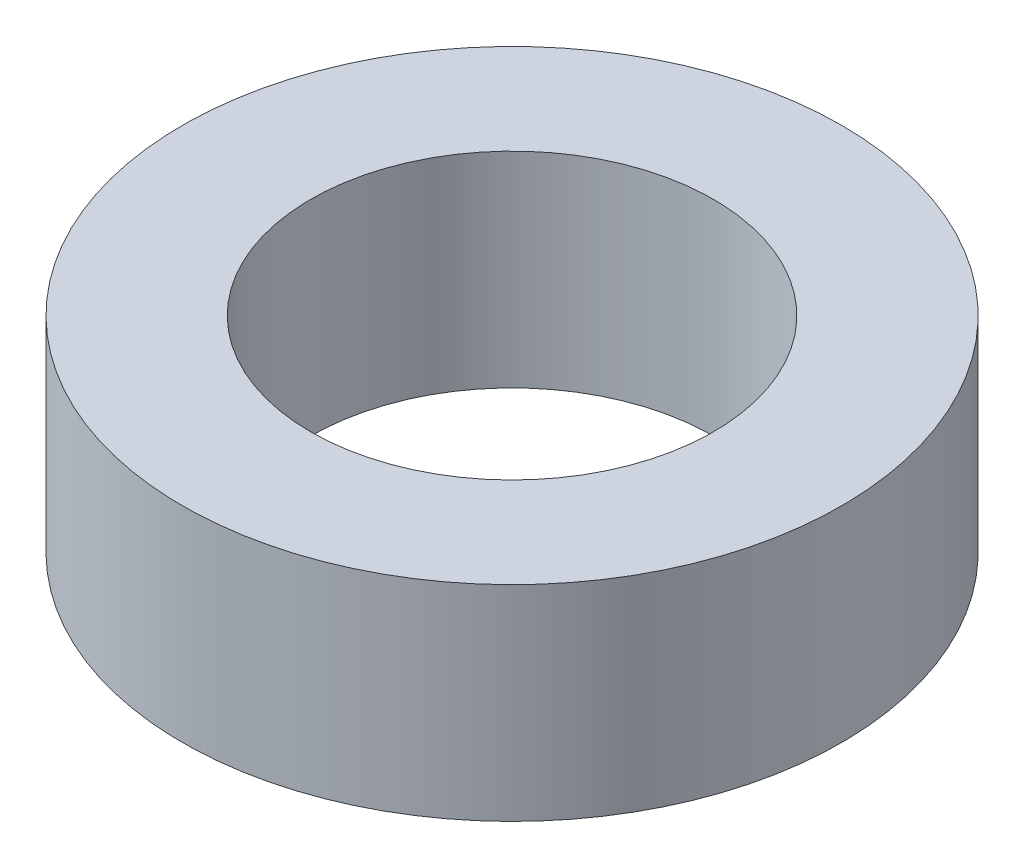
ISO-10303-21;
HEADER;
FILE_DESCRIPTION(('STEP AP214'),'2;1');
FILE_NAME('part.step','',(''),(''),'','','');
FILE_SCHEMA(('AUTOMOTIVE_DESIGN { 1 0 10303 214 1 1 1 1 }'));
ENDSEC;
DATA;
#1=APPLICATION_CONTEXT('core data for automotive mechanical design processes');
#2=APPLICATION_PROTOCOL_DEFINITION('international standard','automotive_design',2000,#1);
#3=PRODUCT_CONTEXT('',#1,'mechanical');
#4=PRODUCT('Part','Part','',(#3));
#5=PRODUCT_RELATED_PRODUCT_CATEGORY('part','',(#4));
#6=PRODUCT_DEFINITION_FORMATION('','',#4);
#7=PRODUCT_DEFINITION_CONTEXT('part definition',#1,'design');
#8=PRODUCT_DEFINITION('design','',#6,#7);
#9=PRODUCT_DEFINITION_SHAPE('','',#8);
#10=(LENGTH_UNIT() NAMED_UNIT(*) SI_UNIT(.MILLI.,.METRE.));
#11=(NAMED_UNIT(*) PLANE_ANGLE_UNIT() SI_UNIT($,.RADIAN.));
#12=(NAMED_UNIT(*) SI_UNIT($,.STERADIAN.) SOLID_ANGLE_UNIT());
#13=UNCERTAINTY_MEASURE_WITH_UNIT(LENGTH_MEASURE(1.E-05),#10,'distance_accuracy_value','');
#14=(GEOMETRIC_REPRESENTATION_CONTEXT(3) GLOBAL_UNCERTAINTY_ASSIGNED_CONTEXT((#13)) GLOBAL_UNIT_ASSIGNED_CONTEXT((#10,
#11,#12)) REPRESENTATION_CONTEXT('',''));
#15=CARTESIAN_POINT('',(0.,0.,0.));
#16=DIRECTION('',(0.,0.,1.));
#17=DIRECTION('',(1.,0.,0.));
#18=AXIS2_PLACEMENT_3D('',#15,#16,#17);
#19=CARTESIAN_POINT('',(0.,0.,0.));
#20=DIRECTION('',(0.,1.,0.));
#21=DIRECTION('',(0.,0.,1.));
#22=AXIS2_PLACEMENT_3D('',#19,#20,#21);
#23=PLANE('',#22);
#24=CARTESIAN_POINT('',(0.,0.,0.));
#25=DIRECTION('',(0.,-1.,0.));
#26=DIRECTION('',(0.,0.,-1.));
#27=AXIS2_PLACEMENT_3D('',#24,#25,#26);
#28=CIRCLE('',#27,45.);
#29=CARTESIAN_POINT('',(0.,0.,-45.));
#30=VERTEX_POINT('',#29);
#31=EDGE_CURVE('E26',#30,#30,#28,.F.);
#32=ORIENTED_EDGE('',*,*,#31,.F.);
#33=EDGE_LOOP('',(#32));
#34=FACE_BOUND('',#33,.T.);
#35=CARTESIAN_POINT('',(0.,0.,0.));
#36=DIRECTION('',(0.,1.,0.));
#37=DIRECTION('',(0.,0.,1.));
#38=AXIS2_PLACEMENT_3D('',#35,#36,#37);
#39=CIRCLE('',#38,27.5);
#40=CARTESIAN_POINT('',(0.,0.,27.5));
#41=VERTEX_POINT('',#40);
#42=EDGE_CURVE('E17',#41,#41,#39,.T.);
#43=ORIENTED_EDGE('',*,*,#42,.T.);
#44=EDGE_LOOP('',(#43));
#45=FACE_BOUND('',#44,.T.);
#46=ADVANCED_FACE('F14',(#34,#45),#23,.F.);
#47=CARTESIAN_POINT('',(0.,0.,0.));
#48=DIRECTION('',(0.,1.,0.));
#49=DIRECTION('',(0.,0.,1.));
#50=AXIS2_PLACEMENT_3D('',#47,#48,#49);
#51=CYLINDRICAL_SURFACE('',#50,27.5);
#52=CARTESIAN_POINT('',(0.,28.,0.));
#53=DIRECTION('',(0.,1.,0.));
#54=DIRECTION('',(0.,0.,1.));
#55=AXIS2_PLACEMENT_3D('',#52,#53,#54);
#56=CIRCLE('',#55,27.5);
#57=CARTESIAN_POINT('',(0.,28.,27.5));
#58=VERTEX_POINT('',#57);
#59=EDGE_CURVE('E21',#58,#58,#56,.F.);
#60=ORIENTED_EDGE('',*,*,#59,.F.);
#61=EDGE_LOOP('',(#60));
#62=FACE_BOUND('',#61,.T.);
#63=ORIENTED_EDGE('',*,*,#42,.F.);
#64=EDGE_LOOP('',(#63));
#65=FACE_BOUND('',#64,.T.);
#66=ADVANCED_FACE('F35',(#62,#65),#51,.F.);
#67=CARTESIAN_POINT('',(0.,28.,0.));
#68=DIRECTION('',(0.,-1.,0.));
#69=DIRECTION('',(0.,0.,-1.));
#70=AXIS2_PLACEMENT_3D('',#67,#68,#69);
#71=CYLINDRICAL_SURFACE('',#70,45.);
#72=ORIENTED_EDGE('',*,*,#31,.T.);
#73=EDGE_LOOP('',(#72));
#74=FACE_BOUND('',#73,.T.);
#75=CARTESIAN_POINT('',(0.,28.,0.));
#76=DIRECTION('',(0.,-1.,0.));
#77=DIRECTION('',(0.,0.,-1.));
#78=AXIS2_PLACEMENT_3D('',#75,#76,#77);
#79=CIRCLE('',#78,45.);
#80=CARTESIAN_POINT('',(0.,28.,-45.));
#81=VERTEX_POINT('',#80);
#82=EDGE_CURVE('E10',#81,#81,#79,.F.);
#83=ORIENTED_EDGE('',*,*,#82,.F.);
#84=EDGE_LOOP('',(#83));
#85=FACE_BOUND('',#84,.T.);
#86=ADVANCED_FACE('F37',(#74,#85),#71,.T.);
#87=CARTESIAN_POINT('',(0.,28.,0.));
#88=DIRECTION('',(0.,1.,0.));
#89=DIRECTION('',(0.,0.,1.));
#90=AXIS2_PLACEMENT_3D('',#87,#88,#89);
#91=PLANE('',#90);
#92=ORIENTED_EDGE('',*,*,#82,.T.);
#93=EDGE_LOOP('',(#92));
#94=FACE_BOUND('',#93,.T.);
#95=ORIENTED_EDGE('',*,*,#59,.T.);
#96=EDGE_LOOP('',(#95));
#97=FACE_BOUND('',#96,.T.);
#98=ADVANCED_FACE('F45',(#94,#97),#91,.T.);
#99=CLOSED_SHELL('',(#46,#66,#86,#98));
#100=MANIFOLD_SOLID_BREP('B1',#99);
#101=ADVANCED_BREP_SHAPE_REPRESENTATION('',(#18,#100),#14);
#102=SHAPE_DEFINITION_REPRESENTATION(#9,#101);
ENDSEC;
END-ISO-10303-21;
